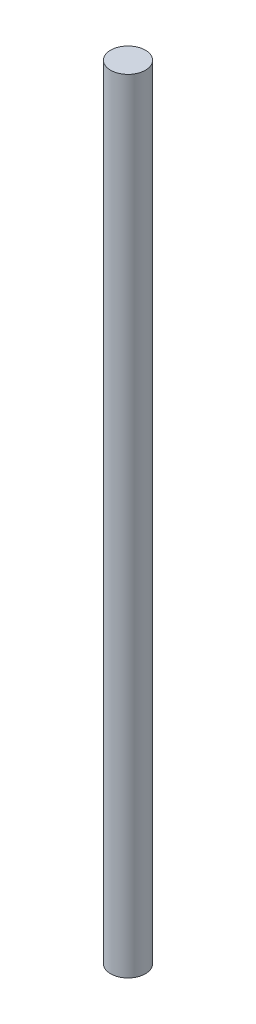
ISO-10303-21;
HEADER;
FILE_DESCRIPTION(('STEP AP214'),'2;1');
FILE_NAME('part.step','',(''),(''),'','','');
FILE_SCHEMA(('AUTOMOTIVE_DESIGN { 1 0 10303 214 1 1 1 1 }'));
ENDSEC;
DATA;
#1=APPLICATION_CONTEXT('core data for automotive mechanical design processes');
#2=APPLICATION_PROTOCOL_DEFINITION('international standard','automotive_design',2000,#1);
#3=PRODUCT_CONTEXT('',#1,'mechanical');
#4=PRODUCT('Part','Part','',(#3));
#5=PRODUCT_RELATED_PRODUCT_CATEGORY('part','',(#4));
#6=PRODUCT_DEFINITION_FORMATION('','',#4);
#7=PRODUCT_DEFINITION_CONTEXT('part definition',#1,'design');
#8=PRODUCT_DEFINITION('design','',#6,#7);
#9=PRODUCT_DEFINITION_SHAPE('','',#8);
#10=(LENGTH_UNIT() NAMED_UNIT(*) SI_UNIT(.MILLI.,.METRE.));
#11=(NAMED_UNIT(*) PLANE_ANGLE_UNIT() SI_UNIT($,.RADIAN.));
#12=(NAMED_UNIT(*) SI_UNIT($,.STERADIAN.) SOLID_ANGLE_UNIT());
#13=UNCERTAINTY_MEASURE_WITH_UNIT(LENGTH_MEASURE(1.E-05),#10,'distance_accuracy_value','');
#14=(GEOMETRIC_REPRESENTATION_CONTEXT(3) GLOBAL_UNCERTAINTY_ASSIGNED_CONTEXT((#13)) GLOBAL_UNIT_ASSIGNED_CONTEXT((#10,
#11,#12)) REPRESENTATION_CONTEXT('',''));
#15=CARTESIAN_POINT('',(0.,0.,0.));
#16=DIRECTION('',(0.,0.,1.));
#17=DIRECTION('',(1.,0.,0.));
#18=AXIS2_PLACEMENT_3D('',#15,#16,#17);
#19=CARTESIAN_POINT('',(0.,90.,0.));
#20=DIRECTION('',(0.,-1.,0.));
#21=DIRECTION('',(0.,0.,-1.));
#22=AXIS2_PLACEMENT_3D('',#19,#20,#21);
#23=CYLINDRICAL_SURFACE('',#22,2.);
#24=CARTESIAN_POINT('',(0.,90.,0.));
#25=DIRECTION('',(0.,1.,0.));
#26=DIRECTION('',(0.,0.,1.));
#27=AXIS2_PLACEMENT_3D('',#24,#25,#26);
#28=CIRCLE('',#27,2.);
#29=CARTESIAN_POINT('',(0.,90.,-2.));
#30=VERTEX_POINT('',#29);
#31=EDGE_CURVE('E10',#30,#30,#28,.T.);
#32=CARTESIAN_POINT('',(0.,0.,0.));
#33=DIRECTION('',(0.,1.,0.));
#34=DIRECTION('',(0.,0.,1.));
#35=AXIS2_PLACEMENT_3D('',#32,#33,#34);
#36=CIRCLE('',#35,2.);
#37=CARTESIAN_POINT('',(0.,0.,-2.));
#38=VERTEX_POINT('',#37);
#39=EDGE_CURVE('E34',#38,#38,#36,.T.);
#40=CARTESIAN_POINT('',(0.,90.,-2.));
#41=CARTESIAN_POINT('',(0.,89.0625,-2.));
#42=CARTESIAN_POINT('',(0.,88.125,-2.));
#43=CARTESIAN_POINT('',(0.,86.25,-2.));
#44=CARTESIAN_POINT('',(0.,85.3125,-2.));
#45=CARTESIAN_POINT('',(0.,83.4375,-2.));
#46=CARTESIAN_POINT('',(0.,82.5,-2.));
#47=CARTESIAN_POINT('',(0.,80.625,-2.));
#48=CARTESIAN_POINT('',(0.,79.6875,-2.));
#49=CARTESIAN_POINT('',(0.,77.8125,-2.));
#50=CARTESIAN_POINT('',(0.,76.875,-2.));
#51=CARTESIAN_POINT('',(0.,75.,-2.));
#52=CARTESIAN_POINT('',(0.,74.0625,-2.));
#53=CARTESIAN_POINT('',(0.,72.1875,-2.));
#54=CARTESIAN_POINT('',(0.,71.25,-2.));
#55=CARTESIAN_POINT('',(0.,69.375,-2.));
#56=CARTESIAN_POINT('',(0.,68.4375,-2.));
#57=CARTESIAN_POINT('',(0.,66.5625,-2.));
#58=CARTESIAN_POINT('',(0.,65.625,-2.));
#59=CARTESIAN_POINT('',(0.,63.75,-2.));
#60=CARTESIAN_POINT('',(0.,62.8125,-2.));
#61=CARTESIAN_POINT('',(0.,60.9375,-2.));
#62=CARTESIAN_POINT('',(0.,60.,-2.));
#63=CARTESIAN_POINT('',(0.,58.125,-2.));
#64=CARTESIAN_POINT('',(0.,57.1875,-2.));
#65=CARTESIAN_POINT('',(0.,55.3125,-2.));
#66=CARTESIAN_POINT('',(0.,54.375,-2.));
#67=CARTESIAN_POINT('',(0.,52.5,-2.));
#68=CARTESIAN_POINT('',(0.,51.5625,-2.));
#69=CARTESIAN_POINT('',(0.,49.6875,-2.));
#70=CARTESIAN_POINT('',(0.,48.75,-2.));
#71=CARTESIAN_POINT('',(0.,46.875,-2.));
#72=CARTESIAN_POINT('',(0.,45.9375,-2.));
#73=CARTESIAN_POINT('',(0.,44.0625,-2.));
#74=CARTESIAN_POINT('',(0.,43.125,-2.));
#75=CARTESIAN_POINT('',(0.,41.25,-2.));
#76=CARTESIAN_POINT('',(0.,40.3125,-2.));
#77=CARTESIAN_POINT('',(0.,38.4375,-2.));
#78=CARTESIAN_POINT('',(0.,37.5,-2.));
#79=CARTESIAN_POINT('',(0.,35.625,-2.));
#80=CARTESIAN_POINT('',(0.,34.6875,-2.));
#81=CARTESIAN_POINT('',(0.,32.8125,-2.));
#82=CARTESIAN_POINT('',(0.,31.875,-2.));
#83=CARTESIAN_POINT('',(0.,30.,-2.));
#84=CARTESIAN_POINT('',(0.,29.0625,-2.));
#85=CARTESIAN_POINT('',(0.,27.1875,-2.));
#86=CARTESIAN_POINT('',(0.,26.25,-2.));
#87=CARTESIAN_POINT('',(0.,24.375,-2.));
#88=CARTESIAN_POINT('',(0.,23.4375,-2.));
#89=CARTESIAN_POINT('',(0.,21.5625,-2.));
#90=CARTESIAN_POINT('',(0.,20.625,-2.));
#91=CARTESIAN_POINT('',(0.,18.75,-2.));
#92=CARTESIAN_POINT('',(0.,17.8125,-2.));
#93=CARTESIAN_POINT('',(0.,15.9375,-2.));
#94=CARTESIAN_POINT('',(0.,15.,-2.));
#95=CARTESIAN_POINT('',(0.,13.125,-2.));
#96=CARTESIAN_POINT('',(0.,12.1875,-2.));
#97=CARTESIAN_POINT('',(0.,10.3125,-2.));
#98=CARTESIAN_POINT('',(0.,9.37499999999999,-2.));
#99=CARTESIAN_POINT('',(0.,7.49999999999999,-2.));
#100=CARTESIAN_POINT('',(0.,6.56249999999999,-2.));
#101=CARTESIAN_POINT('',(0.,4.68749999999999,-2.));
#102=CARTESIAN_POINT('',(0.,3.74999999999998,-2.));
#103=CARTESIAN_POINT('',(0.,1.87499999999998,-2.));
#104=CARTESIAN_POINT('',(0.,0.937499999999986,-2.));
#105=CARTESIAN_POINT('',(0.,0.,-2.));
#106=B_SPLINE_CURVE_WITH_KNOTS('',3,(#40,#41,#42,#43,#44,#45,#46,#47,#48,#49,#50,#51,#52,#53,
#54,#55,#56,#57,#58,#59,#60,#61,#62,#63,#64,#65,#66,#67,#68,#69,#70,#71,#72,#73,#74,#75,#76,#77,
#78,#79,#80,#81,#82,#83,#84,#85,#86,#87,#88,#89,#90,#91,#92,#93,#94,#95,#96,#97,#98,#99,#100,
#101,#102,#103,#104,#105),.UNSPECIFIED.,.F.,.F.,(4,2,2,2,2,2,2,2,2,2,2,2,2,2,2,2,2,2,2,2,2,2,2,
2,2,2,2,2,2,2,2,2,4),(0.,2.8125,5.62499999999999,8.43749999999999,11.25,14.0625,16.875,19.6875,
22.5,25.3125,28.125,30.9375,33.75,36.5625,39.375,42.1875,45.,47.8125,50.625,53.4375,56.25,
59.0625,61.875,64.6875,67.5,70.3125,73.125,75.9375,78.75,81.5625,84.375,87.1875,90.),.UNSPECIFIED.);
#107=EDGE_CURVE('BSEAM31',#30,#38,#106,.T.);
#108=ORIENTED_EDGE('',*,*,#31,.F.);
#109=ORIENTED_EDGE('',*,*,#39,.T.);
#110=ORIENTED_EDGE('',*,*,#107,.T.);
#111=ORIENTED_EDGE('',*,*,#107,.F.);
#112=EDGE_LOOP('',(#108,#110,#109,#111));
#113=FACE_BOUND('',#112,.T.);
#114=ADVANCED_FACE('F31',(#113),#23,.T.);
#115=CARTESIAN_POINT('',(0.,90.,0.));
#116=DIRECTION('',(0.,1.,0.));
#117=DIRECTION('',(0.,0.,1.));
#118=AXIS2_PLACEMENT_3D('',#115,#116,#117);
#119=PLANE('',#118);
#120=ORIENTED_EDGE('',*,*,#31,.T.);
#121=EDGE_LOOP('',(#120));
#122=FACE_BOUND('',#121,.T.);
#123=ADVANCED_FACE('F46',(#122),#119,.T.);
#124=CARTESIAN_POINT('',(0.,0.,0.));
#125=DIRECTION('',(0.,1.,0.));
#126=DIRECTION('',(0.,0.,1.));
#127=AXIS2_PLACEMENT_3D('',#124,#125,#126);
#128=PLANE('',#127);
#129=ORIENTED_EDGE('',*,*,#39,.F.);
#130=EDGE_LOOP('',(#129));
#131=FACE_BOUND('',#130,.T.);
#132=ADVANCED_FACE('F44',(#131),#128,.F.);
#133=CLOSED_SHELL('',(#114,#123,#132));
#134=MANIFOLD_SOLID_BREP('B2',#133);
#135=ADVANCED_BREP_SHAPE_REPRESENTATION('',(#18,#134),#14);
#136=SHAPE_DEFINITION_REPRESENTATION(#9,#135);
ENDSEC;
END-ISO-10303-21;
